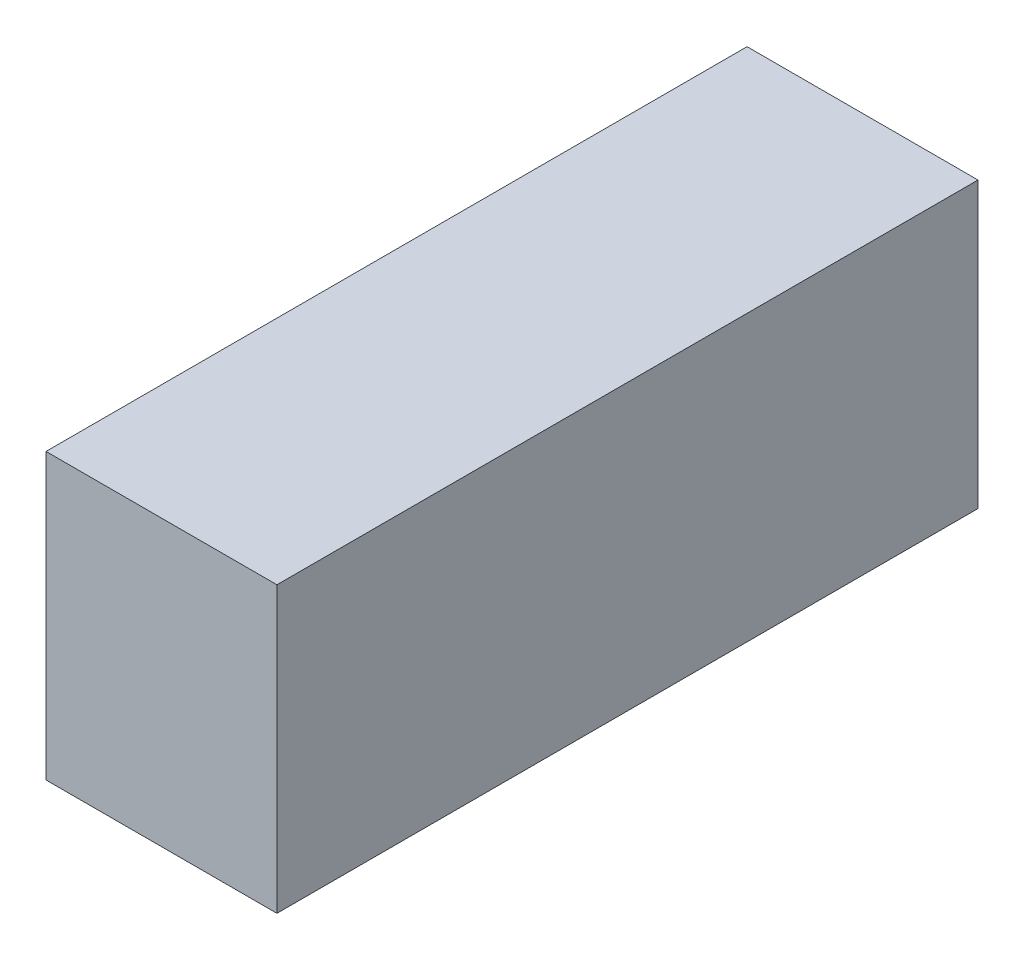
ISO-10303-21;
HEADER;
FILE_DESCRIPTION(('STEP AP214'),'2;1');
FILE_NAME('part.step','',(''),(''),'','','');
FILE_SCHEMA(('AUTOMOTIVE_DESIGN { 1 0 10303 214 1 1 1 1 }'));
ENDSEC;
DATA;
#1=APPLICATION_CONTEXT('core data for automotive mechanical design processes');
#2=APPLICATION_PROTOCOL_DEFINITION('international standard','automotive_design',2000,#1);
#3=PRODUCT_CONTEXT('',#1,'mechanical');
#4=PRODUCT('Part','Part','',(#3));
#5=PRODUCT_RELATED_PRODUCT_CATEGORY('part','',(#4));
#6=PRODUCT_DEFINITION_FORMATION('','',#4);
#7=PRODUCT_DEFINITION_CONTEXT('part definition',#1,'design');
#8=PRODUCT_DEFINITION('design','',#6,#7);
#9=PRODUCT_DEFINITION_SHAPE('','',#8);
#10=(LENGTH_UNIT() NAMED_UNIT(*) SI_UNIT(.MILLI.,.METRE.));
#11=(NAMED_UNIT(*) PLANE_ANGLE_UNIT() SI_UNIT($,.RADIAN.));
#12=(NAMED_UNIT(*) SI_UNIT($,.STERADIAN.) SOLID_ANGLE_UNIT());
#13=UNCERTAINTY_MEASURE_WITH_UNIT(LENGTH_MEASURE(1.E-05),#10,'distance_accuracy_value','');
#14=(GEOMETRIC_REPRESENTATION_CONTEXT(3) GLOBAL_UNCERTAINTY_ASSIGNED_CONTEXT((#13)) GLOBAL_UNIT_ASSIGNED_CONTEXT((#10,
#11,#12)) REPRESENTATION_CONTEXT('',''));
#15=CARTESIAN_POINT('',(0.,0.,0.));
#16=DIRECTION('',(0.,0.,1.));
#17=DIRECTION('',(1.,0.,0.));
#18=AXIS2_PLACEMENT_3D('',#15,#16,#17);
#19=CARTESIAN_POINT('',(28.,-34.5,170.));
#20=DIRECTION('',(-1.,0.,0.));
#21=DIRECTION('',(0.,0.,1.));
#22=AXIS2_PLACEMENT_3D('',#19,#20,#21);
#23=PLANE('',#22);
#24=DIRECTION('',(0.,1.,0.));
#25=VECTOR('',#24,1.);
#26=CARTESIAN_POINT('',(28.,-34.5,0.));
#27=LINE('',#26,#25);
#28=CARTESIAN_POINT('',(28.,-34.5,0.));
#29=VERTEX_POINT('',#28);
#30=CARTESIAN_POINT('',(28.,34.5,0.));
#31=VERTEX_POINT('',#30);
#32=EDGE_CURVE('E107',#29,#31,#27,.T.);
#33=ORIENTED_EDGE('',*,*,#32,.T.);
#34=DIRECTION('',(0.,0.,-1.));
#35=VECTOR('',#34,1.);
#36=CARTESIAN_POINT('',(28.,34.5,170.));
#37=LINE('',#36,#35);
#38=CARTESIAN_POINT('',(28.,34.5,170.));
#39=VERTEX_POINT('',#38);
#40=EDGE_CURVE('E11',#39,#31,#37,.T.);
#41=ORIENTED_EDGE('',*,*,#40,.F.);
#42=DIRECTION('',(0.,1.,0.));
#43=VECTOR('',#42,1.);
#44=CARTESIAN_POINT('',(28.,-34.5,170.));
#45=LINE('',#44,#43);
#46=CARTESIAN_POINT('',(28.,-34.5,170.));
#47=VERTEX_POINT('',#46);
#48=EDGE_CURVE('E91',#47,#39,#45,.T.);
#49=ORIENTED_EDGE('',*,*,#48,.F.);
#50=DIRECTION('',(0.,0.,-1.));
#51=VECTOR('',#50,1.);
#52=CARTESIAN_POINT('',(28.,-34.5,170.));
#53=LINE('',#52,#51);
#54=EDGE_CURVE('E103',#47,#29,#53,.T.);
#55=ORIENTED_EDGE('',*,*,#54,.T.);
#56=EDGE_LOOP('',(#33,#41,#49,#55));
#57=FACE_BOUND('',#56,.T.);
#58=ADVANCED_FACE('F39',(#57),#23,.F.);
#59=CARTESIAN_POINT('',(-28.,34.5,170.));
#60=DIRECTION('',(0.,-1.,0.));
#61=DIRECTION('',(0.,0.,-1.));
#62=AXIS2_PLACEMENT_3D('',#59,#60,#61);
#63=PLANE('',#62);
#64=DIRECTION('',(-1.,0.,0.));
#65=VECTOR('',#64,1.);
#66=CARTESIAN_POINT('',(-28.,34.5,0.));
#67=LINE('',#66,#65);
#68=CARTESIAN_POINT('',(-28.,34.5,0.));
#69=VERTEX_POINT('',#68);
#70=EDGE_CURVE('E96',#31,#69,#67,.T.);
#71=ORIENTED_EDGE('',*,*,#70,.T.);
#72=DIRECTION('',(0.,0.,-1.));
#73=VECTOR('',#72,1.);
#74=CARTESIAN_POINT('',(-28.,34.5,170.));
#75=LINE('',#74,#73);
#76=CARTESIAN_POINT('',(-28.,34.5,170.));
#77=VERTEX_POINT('',#76);
#78=EDGE_CURVE('E48',#77,#69,#75,.T.);
#79=ORIENTED_EDGE('',*,*,#78,.F.);
#80=DIRECTION('',(-1.,0.,0.));
#81=VECTOR('',#80,1.);
#82=CARTESIAN_POINT('',(-28.,34.5,170.));
#83=LINE('',#82,#81);
#84=EDGE_CURVE('E86',#39,#77,#83,.T.);
#85=ORIENTED_EDGE('',*,*,#84,.F.);
#86=ORIENTED_EDGE('',*,*,#40,.T.);
#87=EDGE_LOOP('',(#71,#79,#85,#86));
#88=FACE_BOUND('',#87,.T.);
#89=ADVANCED_FACE('F95',(#88),#63,.F.);
#90=CARTESIAN_POINT('',(-28.,-34.5,170.));
#91=DIRECTION('',(1.,0.,0.));
#92=DIRECTION('',(0.,0.,-1.));
#93=AXIS2_PLACEMENT_3D('',#90,#91,#92);
#94=PLANE('',#93);
#95=DIRECTION('',(0.,-1.,0.));
#96=VECTOR('',#95,1.);
#97=CARTESIAN_POINT('',(-28.,-34.5,0.));
#98=LINE('',#97,#96);
#99=CARTESIAN_POINT('',(-28.,-34.5,0.));
#100=VERTEX_POINT('',#99);
#101=EDGE_CURVE('E73',#69,#100,#98,.T.);
#102=ORIENTED_EDGE('',*,*,#101,.T.);
#103=DIRECTION('',(0.,0.,-1.));
#104=VECTOR('',#103,1.);
#105=CARTESIAN_POINT('',(-28.,-34.5,170.));
#106=LINE('',#105,#104);
#107=CARTESIAN_POINT('',(-28.,-34.5,170.));
#108=VERTEX_POINT('',#107);
#109=EDGE_CURVE('E98',#108,#100,#106,.T.);
#110=ORIENTED_EDGE('',*,*,#109,.F.);
#111=DIRECTION('',(0.,-1.,0.));
#112=VECTOR('',#111,1.);
#113=CARTESIAN_POINT('',(-28.,-34.5,170.));
#114=LINE('',#113,#112);
#115=EDGE_CURVE('E89',#77,#108,#114,.T.);
#116=ORIENTED_EDGE('',*,*,#115,.F.);
#117=ORIENTED_EDGE('',*,*,#78,.T.);
#118=EDGE_LOOP('',(#102,#110,#116,#117));
#119=FACE_BOUND('',#118,.T.);
#120=ADVANCED_FACE('F99',(#119),#94,.F.);
#121=CARTESIAN_POINT('',(-28.,-34.5,170.));
#122=DIRECTION('',(0.,1.,0.));
#123=DIRECTION('',(0.,0.,1.));
#124=AXIS2_PLACEMENT_3D('',#121,#122,#123);
#125=PLANE('',#124);
#126=DIRECTION('',(1.,0.,0.));
#127=VECTOR('',#126,1.);
#128=CARTESIAN_POINT('',(-28.,-34.5,0.));
#129=LINE('',#128,#127);
#130=EDGE_CURVE('E79',#100,#29,#129,.T.);
#131=ORIENTED_EDGE('',*,*,#130,.T.);
#132=ORIENTED_EDGE('',*,*,#54,.F.);
#133=DIRECTION('',(1.,0.,0.));
#134=VECTOR('',#133,1.);
#135=CARTESIAN_POINT('',(-28.,-34.5,170.));
#136=LINE('',#135,#134);
#137=EDGE_CURVE('E56',#108,#47,#136,.T.);
#138=ORIENTED_EDGE('',*,*,#137,.F.);
#139=ORIENTED_EDGE('',*,*,#109,.T.);
#140=EDGE_LOOP('',(#131,#132,#138,#139));
#141=FACE_BOUND('',#140,.T.);
#142=ADVANCED_FACE('F120',(#141),#125,.F.);
#143=CARTESIAN_POINT('',(0.,0.,170.));
#144=DIRECTION('',(0.,0.,-1.));
#145=DIRECTION('',(-1.,0.,0.));
#146=AXIS2_PLACEMENT_3D('',#143,#144,#145);
#147=PLANE('',#146);
#148=ORIENTED_EDGE('',*,*,#48,.T.);
#149=ORIENTED_EDGE('',*,*,#84,.T.);
#150=ORIENTED_EDGE('',*,*,#115,.T.);
#151=ORIENTED_EDGE('',*,*,#137,.T.);
#152=EDGE_LOOP('',(#148,#149,#150,#151));
#153=FACE_BOUND('',#152,.T.);
#154=ADVANCED_FACE('F87',(#153),#147,.F.);
#155=CARTESIAN_POINT('',(0.,0.,0.));
#156=DIRECTION('',(0.,0.,-1.));
#157=DIRECTION('',(-1.,0.,0.));
#158=AXIS2_PLACEMENT_3D('',#155,#156,#157);
#159=PLANE('',#158);
#160=ORIENTED_EDGE('',*,*,#32,.F.);
#161=ORIENTED_EDGE('',*,*,#130,.F.);
#162=ORIENTED_EDGE('',*,*,#101,.F.);
#163=ORIENTED_EDGE('',*,*,#70,.F.);
#164=EDGE_LOOP('',(#160,#161,#162,#163));
#165=FACE_BOUND('',#164,.T.);
#166=ADVANCED_FACE('F123',(#165),#159,.T.);
#167=CLOSED_SHELL('',(#58,#89,#120,#142,#154,#166));
#168=MANIFOLD_SOLID_BREP('B2',#167);
#169=ADVANCED_BREP_SHAPE_REPRESENTATION('',(#18,#168),#14);
#170=SHAPE_DEFINITION_REPRESENTATION(#9,#169);
ENDSEC;
END-ISO-10303-21;
